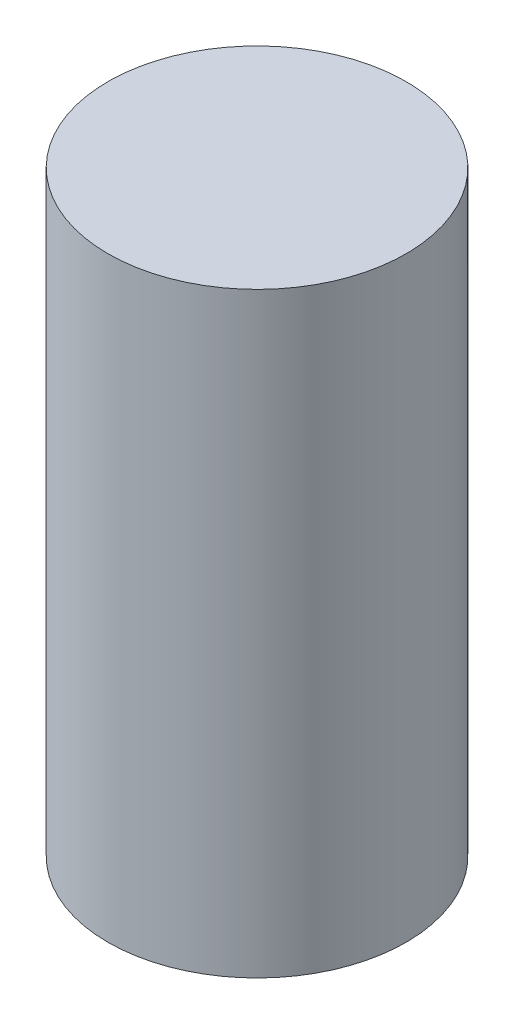
ISO-10303-21;
HEADER;
FILE_DESCRIPTION(('STEP AP214'),'2;1');
FILE_NAME('part.step','',(''),(''),'','','');
FILE_SCHEMA(('AUTOMOTIVE_DESIGN { 1 0 10303 214 1 1 1 1 }'));
ENDSEC;
DATA;
#1=APPLICATION_CONTEXT('core data for automotive mechanical design processes');
#2=APPLICATION_PROTOCOL_DEFINITION('international standard','automotive_design',2000,#1);
#3=PRODUCT_CONTEXT('',#1,'mechanical');
#4=PRODUCT('Part','Part','',(#3));
#5=PRODUCT_RELATED_PRODUCT_CATEGORY('part','',(#4));
#6=PRODUCT_DEFINITION_FORMATION('','',#4);
#7=PRODUCT_DEFINITION_CONTEXT('part definition',#1,'design');
#8=PRODUCT_DEFINITION('design','',#6,#7);
#9=PRODUCT_DEFINITION_SHAPE('','',#8);
#10=(LENGTH_UNIT() NAMED_UNIT(*) SI_UNIT(.MILLI.,.METRE.));
#11=(NAMED_UNIT(*) PLANE_ANGLE_UNIT() SI_UNIT($,.RADIAN.));
#12=(NAMED_UNIT(*) SI_UNIT($,.STERADIAN.) SOLID_ANGLE_UNIT());
#13=UNCERTAINTY_MEASURE_WITH_UNIT(LENGTH_MEASURE(1.E-05),#10,'distance_accuracy_value','');
#14=(GEOMETRIC_REPRESENTATION_CONTEXT(3) GLOBAL_UNCERTAINTY_ASSIGNED_CONTEXT((#13)) GLOBAL_UNIT_ASSIGNED_CONTEXT((#10,
#11,#12)) REPRESENTATION_CONTEXT('',''));
#15=CARTESIAN_POINT('',(0.,0.,0.));
#16=DIRECTION('',(0.,0.,1.));
#17=DIRECTION('',(1.,0.,0.));
#18=AXIS2_PLACEMENT_3D('',#15,#16,#17);
#19=CARTESIAN_POINT('',(0.,30.,0.));
#20=DIRECTION('',(0.,-1.,0.));
#21=DIRECTION('',(0.,0.,-1.));
#22=AXIS2_PLACEMENT_3D('',#19,#20,#21);
#23=CYLINDRICAL_SURFACE('',#22,7.5);
#24=CARTESIAN_POINT('',(0.,30.,0.));
#25=DIRECTION('',(0.,1.,0.));
#26=DIRECTION('',(0.,0.,1.));
#27=AXIS2_PLACEMENT_3D('',#24,#25,#26);
#28=CIRCLE('',#27,7.5);
#29=CARTESIAN_POINT('',(0.,30.,7.5));
#30=VERTEX_POINT('',#29);
#31=EDGE_CURVE('E10',#30,#30,#28,.T.);
#32=ORIENTED_EDGE('',*,*,#31,.F.);
#33=EDGE_LOOP('',(#32));
#34=FACE_BOUND('',#33,.T.);
#35=CARTESIAN_POINT('',(0.,0.,0.));
#36=DIRECTION('',(0.,1.,0.));
#37=DIRECTION('',(0.,0.,1.));
#38=AXIS2_PLACEMENT_3D('',#35,#36,#37);
#39=CIRCLE('',#38,7.5);
#40=CARTESIAN_POINT('',(0.,0.,7.5));
#41=VERTEX_POINT('',#40);
#42=EDGE_CURVE('E46',#41,#41,#39,.T.);
#43=ORIENTED_EDGE('',*,*,#42,.T.);
#44=EDGE_LOOP('',(#43));
#45=FACE_BOUND('',#44,.T.);
#46=ADVANCED_FACE('F43',(#34,#45),#23,.T.);
#47=CARTESIAN_POINT('',(0.,30.,0.));
#48=DIRECTION('',(0.,1.,0.));
#49=DIRECTION('',(0.,0.,1.));
#50=AXIS2_PLACEMENT_3D('',#47,#48,#49);
#51=PLANE('',#50);
#52=ORIENTED_EDGE('',*,*,#31,.T.);
#53=EDGE_LOOP('',(#52));
#54=FACE_BOUND('',#53,.T.);
#55=ADVANCED_FACE('F60',(#54),#51,.T.);
#56=CARTESIAN_POINT('',(0.,0.,0.));
#57=DIRECTION('',(0.,1.,0.));
#58=DIRECTION('',(0.,0.,1.));
#59=AXIS2_PLACEMENT_3D('',#56,#57,#58);
#60=PLANE('',#59);
#61=ORIENTED_EDGE('',*,*,#42,.F.);
#62=EDGE_LOOP('',(#61));
#63=FACE_BOUND('',#62,.T.);
#64=ADVANCED_FACE('F58',(#63),#60,.F.);
#65=CLOSED_SHELL('',(#46,#55,#64));
#66=MANIFOLD_SOLID_BREP('B2',#65);
#67=ADVANCED_BREP_SHAPE_REPRESENTATION('',(#18,#66),#14);
#68=SHAPE_DEFINITION_REPRESENTATION(#9,#67);
ENDSEC;
END-ISO-10303-21;
